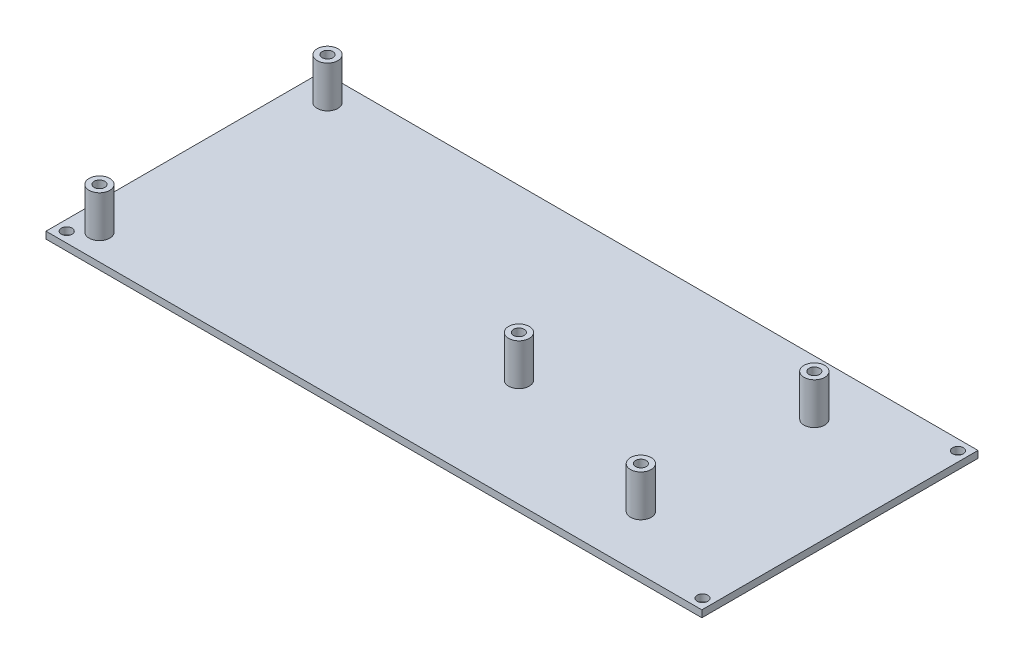
ISO-10303-21;
HEADER;
FILE_DESCRIPTION(('STEP AP214'),'2;1');
FILE_NAME('part.step','',(''),(''),'','','');
FILE_SCHEMA(('AUTOMOTIVE_DESIGN { 1 0 10303 214 1 1 1 1 }'));
ENDSEC;
DATA;
#1=APPLICATION_CONTEXT('core data for automotive mechanical design processes');
#2=APPLICATION_PROTOCOL_DEFINITION('international standard','automotive_design',2000,#1);
#3=PRODUCT_CONTEXT('',#1,'mechanical');
#4=PRODUCT('Part','Part','',(#3));
#5=PRODUCT_RELATED_PRODUCT_CATEGORY('part','',(#4));
#6=PRODUCT_DEFINITION_FORMATION('','',#4);
#7=PRODUCT_DEFINITION_CONTEXT('part definition',#1,'design');
#8=PRODUCT_DEFINITION('design','',#6,#7);
#9=PRODUCT_DEFINITION_SHAPE('','',#8);
#10=(LENGTH_UNIT() NAMED_UNIT(*) SI_UNIT(.MILLI.,.METRE.));
#11=(NAMED_UNIT(*) PLANE_ANGLE_UNIT() SI_UNIT($,.RADIAN.));
#12=(NAMED_UNIT(*) SI_UNIT($,.STERADIAN.) SOLID_ANGLE_UNIT());
#13=UNCERTAINTY_MEASURE_WITH_UNIT(LENGTH_MEASURE(1.E-05),#10,'distance_accuracy_value','');
#14=(GEOMETRIC_REPRESENTATION_CONTEXT(3) GLOBAL_UNCERTAINTY_ASSIGNED_CONTEXT((#13)) GLOBAL_UNIT_ASSIGNED_CONTEXT((#10,
#11,#12)) REPRESENTATION_CONTEXT('',''));
#15=CARTESIAN_POINT('',(0.,0.,0.));
#16=DIRECTION('',(0.,0.,1.));
#17=DIRECTION('',(1.,0.,0.));
#18=AXIS2_PLACEMENT_3D('',#15,#16,#17);
#19=CARTESIAN_POINT('',(0.,2.,0.));
#20=DIRECTION('',(0.,1.,0.));
#21=DIRECTION('',(0.,0.,1.));
#22=AXIS2_PLACEMENT_3D('',#19,#20,#21);
#23=PLANE('',#22);
#24=CARTESIAN_POINT('',(-67.7487922705313,2.,31.9302898550725));
#25=DIRECTION('',(0.,1.,0.));
#26=DIRECTION('',(0.,0.,1.));
#27=AXIS2_PLACEMENT_3D('',#24,#25,#26);
#28=CIRCLE('',#27,3.00000000000001);
#29=CARTESIAN_POINT('',(-67.7487922705313,2.,34.9302898550725));
#30=VERTEX_POINT('',#29);
#31=EDGE_CURVE('E287',#30,#30,#28,.T.);
#32=ORIENTED_EDGE('',*,*,#31,.F.);
#33=EDGE_LOOP('',(#32));
#34=FACE_BOUND('',#33,.T.);
#35=CARTESIAN_POINT('',(-67.2587922705314,2.,-33.6497101449275));
#36=DIRECTION('',(0.,1.,0.));
#37=DIRECTION('',(0.,0.,1.));
#38=AXIS2_PLACEMENT_3D('',#35,#36,#37);
#39=CIRCLE('',#38,3.00000000000001);
#40=CARTESIAN_POINT('',(-67.2587922705314,2.,-30.6497101449275));
#41=VERTEX_POINT('',#40);
#42=EDGE_CURVE('E278',#41,#41,#39,.T.);
#43=ORIENTED_EDGE('',*,*,#42,.F.);
#44=EDGE_LOOP('',(#43));
#45=FACE_BOUND('',#44,.T.);
#46=CARTESIAN_POINT('',(30.1412077294686,2.,8.31028985507247));
#47=DIRECTION('',(0.,1.,0.));
#48=DIRECTION('',(0.,0.,1.));
#49=AXIS2_PLACEMENT_3D('',#46,#47,#48);
#50=CIRCLE('',#49,3.);
#51=CARTESIAN_POINT('',(30.1412077294686,2.,11.3102898550725));
#52=VERTEX_POINT('',#51);
#53=EDGE_CURVE('E269',#52,#52,#50,.T.);
#54=ORIENTED_EDGE('',*,*,#53,.F.);
#55=EDGE_LOOP('',(#54));
#56=FACE_BOUND('',#55,.T.);
#57=CARTESIAN_POINT('',(80.7112077294687,2.,23.5502898550725));
#58=DIRECTION('',(0.,1.,0.));
#59=DIRECTION('',(0.,0.,1.));
#60=AXIS2_PLACEMENT_3D('',#57,#58,#59);
#61=CIRCLE('',#60,3.00000000000001);
#62=CARTESIAN_POINT('',(80.7112077294687,2.,26.5502898550725));
#63=VERTEX_POINT('',#62);
#64=EDGE_CURVE('E261',#63,#63,#61,.T.);
#65=ORIENTED_EDGE('',*,*,#64,.F.);
#66=EDGE_LOOP('',(#65));
#67=FACE_BOUND('',#66,.T.);
#68=CARTESIAN_POINT('',(82.7112077294686,2.,-24.7097101449275));
#69=DIRECTION('',(0.,1.,0.));
#70=DIRECTION('',(0.,0.,1.));
#71=AXIS2_PLACEMENT_3D('',#68,#69,#70);
#72=CIRCLE('',#71,3.00000000000001);
#73=CARTESIAN_POINT('',(82.7112077294686,2.,-21.7097101449275));
#74=VERTEX_POINT('',#73);
#75=EDGE_CURVE('E252',#74,#74,#72,.T.);
#76=ORIENTED_EDGE('',*,*,#75,.F.);
#77=EDGE_LOOP('',(#76));
#78=FACE_BOUND('',#77,.T.);
#79=CARTESIAN_POINT('',(111.435917927843,2.,36.4202898550725));
#80=DIRECTION('',(0.,1.,0.));
#81=DIRECTION('',(0.,0.,1.));
#82=AXIS2_PLACEMENT_3D('',#79,#80,#81);
#83=CIRCLE('',#82,1.54999999999999);
#84=CARTESIAN_POINT('',(111.435917927843,2.,37.9702898550725));
#85=VERTEX_POINT('',#84);
#86=EDGE_CURVE('E238',#85,#85,#83,.T.);
#87=ORIENTED_EDGE('',*,*,#86,.F.);
#88=EDGE_LOOP('',(#87));
#89=FACE_BOUND('',#88,.T.);
#90=CARTESIAN_POINT('',(-72.7487922705314,2.,-37.5797101449275));
#91=DIRECTION('',(0.,1.,0.));
#92=DIRECTION('',(0.,0.,1.));
#93=AXIS2_PLACEMENT_3D('',#90,#91,#92);
#94=CIRCLE('',#93,1.54999999999999);
#95=CARTESIAN_POINT('',(-72.7487922705314,2.,-36.0297101449275));
#96=VERTEX_POINT('',#95);
#97=EDGE_CURVE('E103',#96,#96,#94,.T.);
#98=ORIENTED_EDGE('',*,*,#97,.F.);
#99=EDGE_LOOP('',(#98));
#100=FACE_BOUND('',#99,.T.);
#101=DIRECTION('',(0.,0.,1.));
#102=VECTOR('',#101,1.);
#103=CARTESIAN_POINT('',(-75.7487922705314,2.,-40.5797101449275));
#104=LINE('',#103,#102);
#105=CARTESIAN_POINT('',(-75.7487922705314,2.,-40.5797101449275));
#106=VERTEX_POINT('',#105);
#107=CARTESIAN_POINT('',(-75.7487922705314,2.,39.4202898550725));
#108=VERTEX_POINT('',#107);
#109=EDGE_CURVE('E85',#106,#108,#104,.T.);
#110=ORIENTED_EDGE('',*,*,#109,.T.);
#111=DIRECTION('',(1.,0.,0.));
#112=VECTOR('',#111,1.);
#113=CARTESIAN_POINT('',(-75.7487922705314,2.,39.4202898550725));
#114=LINE('',#113,#112);
#115=CARTESIAN_POINT('',(114.251207729469,2.,39.4202898550725));
#116=VERTEX_POINT('',#115);
#117=EDGE_CURVE('E80',#108,#116,#114,.T.);
#118=ORIENTED_EDGE('',*,*,#117,.T.);
#119=DIRECTION('',(0.,0.,-1.));
#120=VECTOR('',#119,1.);
#121=CARTESIAN_POINT('',(114.251207729469,2.,-40.5797101449275));
#122=LINE('',#121,#120);
#123=CARTESIAN_POINT('',(114.251207729469,2.,-40.5797101449275));
#124=VERTEX_POINT('',#123);
#125=EDGE_CURVE('E83',#116,#124,#122,.T.);
#126=ORIENTED_EDGE('',*,*,#125,.T.);
#127=DIRECTION('',(-1.,0.,0.));
#128=VECTOR('',#127,1.);
#129=CARTESIAN_POINT('',(-75.7487922705314,2.,-40.5797101449275));
#130=LINE('',#129,#128);
#131=EDGE_CURVE('E49',#124,#106,#130,.T.);
#132=ORIENTED_EDGE('',*,*,#131,.T.);
#133=EDGE_LOOP('',(#110,#118,#126,#132));
#134=FACE_BOUND('',#133,.T.);
#135=CARTESIAN_POINT('',(111.435917927843,2.,-37.5797101449275));
#136=DIRECTION('',(0.,1.,0.));
#137=DIRECTION('',(0.,0.,1.));
#138=AXIS2_PLACEMENT_3D('',#135,#136,#137);
#139=CIRCLE('',#138,1.54999999999999);
#140=CARTESIAN_POINT('',(111.435917927843,2.,-36.0297101449275));
#141=VERTEX_POINT('',#140);
#142=EDGE_CURVE('E230',#141,#141,#139,.T.);
#143=ORIENTED_EDGE('',*,*,#142,.F.);
#144=EDGE_LOOP('',(#143));
#145=FACE_BOUND('',#144,.T.);
#146=CARTESIAN_POINT('',(-72.7487922705314,2.,36.4202898550725));
#147=DIRECTION('',(0.,1.,0.));
#148=DIRECTION('',(0.,0.,1.));
#149=AXIS2_PLACEMENT_3D('',#146,#147,#148);
#150=CIRCLE('',#149,1.54999999999999);
#151=CARTESIAN_POINT('',(-72.7487922705314,2.,37.9702898550725));
#152=VERTEX_POINT('',#151);
#153=EDGE_CURVE('E243',#152,#152,#150,.T.);
#154=ORIENTED_EDGE('',*,*,#153,.F.);
#155=EDGE_LOOP('',(#154));
#156=FACE_BOUND('',#155,.T.);
#157=ADVANCED_FACE('F32',(#34,#45,#56,#67,#78,#89,#100,#134,#145,#156),#23,.T.);
#158=CARTESIAN_POINT('',(0.,0.,0.));
#159=DIRECTION('',(0.,1.,0.));
#160=DIRECTION('',(0.,0.,1.));
#161=AXIS2_PLACEMENT_3D('',#158,#159,#160);
#162=PLANE('',#161);
#163=DIRECTION('',(0.,0.,1.));
#164=VECTOR('',#163,1.);
#165=CARTESIAN_POINT('',(-75.7487922705314,0.,-40.5797101449275));
#166=LINE('',#165,#164);
#167=CARTESIAN_POINT('',(-75.7487922705314,0.,-40.5797101449275));
#168=VERTEX_POINT('',#167);
#169=CARTESIAN_POINT('',(-75.7487922705314,0.,39.4202898550725));
#170=VERTEX_POINT('',#169);
#171=EDGE_CURVE('E100',#168,#170,#166,.T.);
#172=ORIENTED_EDGE('',*,*,#171,.F.);
#173=DIRECTION('',(-1.,0.,0.));
#174=VECTOR('',#173,1.);
#175=CARTESIAN_POINT('',(-75.7487922705314,0.,-40.5797101449275));
#176=LINE('',#175,#174);
#177=CARTESIAN_POINT('',(114.251207729469,0.,-40.5797101449275));
#178=VERTEX_POINT('',#177);
#179=EDGE_CURVE('E72',#178,#168,#176,.T.);
#180=ORIENTED_EDGE('',*,*,#179,.F.);
#181=DIRECTION('',(0.,0.,-1.));
#182=VECTOR('',#181,1.);
#183=CARTESIAN_POINT('',(114.251207729469,0.,-40.5797101449275));
#184=LINE('',#183,#182);
#185=CARTESIAN_POINT('',(114.251207729469,0.,39.4202898550725));
#186=VERTEX_POINT('',#185);
#187=EDGE_CURVE('E66',#186,#178,#184,.T.);
#188=ORIENTED_EDGE('',*,*,#187,.F.);
#189=DIRECTION('',(1.,0.,0.));
#190=VECTOR('',#189,1.);
#191=CARTESIAN_POINT('',(-75.7487922705314,0.,39.4202898550725));
#192=LINE('',#191,#190);
#193=EDGE_CURVE('E90',#170,#186,#192,.T.);
#194=ORIENTED_EDGE('',*,*,#193,.F.);
#195=EDGE_LOOP('',(#172,#180,#188,#194));
#196=FACE_BOUND('',#195,.T.);
#197=CARTESIAN_POINT('',(-72.7487922705314,0.,-37.5797101449275));
#198=DIRECTION('',(0.,1.,0.));
#199=DIRECTION('',(0.,0.,1.));
#200=AXIS2_PLACEMENT_3D('',#197,#198,#199);
#201=CIRCLE('',#200,1.54999999999999);
#202=CARTESIAN_POINT('',(-72.7487922705314,0.,-36.0297101449275));
#203=VERTEX_POINT('',#202);
#204=EDGE_CURVE('E228',#203,#203,#201,.T.);
#205=ORIENTED_EDGE('',*,*,#204,.T.);
#206=EDGE_LOOP('',(#205));
#207=FACE_BOUND('',#206,.T.);
#208=CARTESIAN_POINT('',(111.435917927843,0.,-37.5797101449275));
#209=DIRECTION('',(0.,1.,0.));
#210=DIRECTION('',(0.,0.,1.));
#211=AXIS2_PLACEMENT_3D('',#208,#209,#210);
#212=CIRCLE('',#211,1.54999999999999);
#213=CARTESIAN_POINT('',(111.435917927843,0.,-36.0297101449275));
#214=VERTEX_POINT('',#213);
#215=EDGE_CURVE('E234',#214,#214,#212,.T.);
#216=ORIENTED_EDGE('',*,*,#215,.T.);
#217=EDGE_LOOP('',(#216));
#218=FACE_BOUND('',#217,.T.);
#219=CARTESIAN_POINT('',(111.435917927843,0.,36.4202898550725));
#220=DIRECTION('',(0.,1.,0.));
#221=DIRECTION('',(0.,0.,1.));
#222=AXIS2_PLACEMENT_3D('',#219,#220,#221);
#223=CIRCLE('',#222,1.54999999999999);
#224=CARTESIAN_POINT('',(111.435917927843,0.,37.9702898550725));
#225=VERTEX_POINT('',#224);
#226=EDGE_CURVE('E240',#225,#225,#223,.T.);
#227=ORIENTED_EDGE('',*,*,#226,.T.);
#228=EDGE_LOOP('',(#227));
#229=FACE_BOUND('',#228,.T.);
#230=CARTESIAN_POINT('',(-72.7487922705314,0.,36.4202898550725));
#231=DIRECTION('',(0.,1.,0.));
#232=DIRECTION('',(0.,0.,1.));
#233=AXIS2_PLACEMENT_3D('',#230,#231,#232);
#234=CIRCLE('',#233,1.54999999999999);
#235=CARTESIAN_POINT('',(-72.7487922705314,0.,37.9702898550725));
#236=VERTEX_POINT('',#235);
#237=EDGE_CURVE('E246',#236,#236,#234,.T.);
#238=ORIENTED_EDGE('',*,*,#237,.T.);
#239=EDGE_LOOP('',(#238));
#240=FACE_BOUND('',#239,.T.);
#241=ADVANCED_FACE('F150',(#196,#207,#218,#229,#240),#162,.F.);
#242=CARTESIAN_POINT('',(-75.7487922705314,2.,-40.5797101449275));
#243=DIRECTION('',(1.,0.,0.));
#244=DIRECTION('',(0.,0.,-1.));
#245=AXIS2_PLACEMENT_3D('',#242,#243,#244);
#246=PLANE('',#245);
#247=ORIENTED_EDGE('',*,*,#171,.T.);
#248=DIRECTION('',(0.,-1.,0.));
#249=VECTOR('',#248,1.);
#250=CARTESIAN_POINT('',(-75.7487922705314,2.,39.4202898550725));
#251=LINE('',#250,#249);
#252=EDGE_CURVE('E91',#108,#170,#251,.T.);
#253=ORIENTED_EDGE('',*,*,#252,.F.);
#254=ORIENTED_EDGE('',*,*,#109,.F.);
#255=DIRECTION('',(0.,-1.,0.));
#256=VECTOR('',#255,1.);
#257=CARTESIAN_POINT('',(-75.7487922705314,2.,-40.5797101449275));
#258=LINE('',#257,#256);
#259=EDGE_CURVE('E96',#106,#168,#258,.T.);
#260=ORIENTED_EDGE('',*,*,#259,.T.);
#261=EDGE_LOOP('',(#247,#253,#254,#260));
#262=FACE_BOUND('',#261,.T.);
#263=ADVANCED_FACE('F34',(#262),#246,.F.);
#264=CARTESIAN_POINT('',(-75.7487922705314,2.,39.4202898550725));
#265=DIRECTION('',(0.,0.,-1.));
#266=DIRECTION('',(-1.,0.,0.));
#267=AXIS2_PLACEMENT_3D('',#264,#265,#266);
#268=PLANE('',#267);
#269=ORIENTED_EDGE('',*,*,#193,.T.);
#270=DIRECTION('',(0.,-1.,0.));
#271=VECTOR('',#270,1.);
#272=CARTESIAN_POINT('',(114.251207729469,2.,39.4202898550725));
#273=LINE('',#272,#271);
#274=EDGE_CURVE('E88',#116,#186,#273,.T.);
#275=ORIENTED_EDGE('',*,*,#274,.F.);
#276=ORIENTED_EDGE('',*,*,#117,.F.);
#277=ORIENTED_EDGE('',*,*,#252,.T.);
#278=EDGE_LOOP('',(#269,#275,#276,#277));
#279=FACE_BOUND('',#278,.T.);
#280=ADVANCED_FACE('F89',(#279),#268,.F.);
#281=CARTESIAN_POINT('',(114.251207729469,2.,-40.5797101449275));
#282=DIRECTION('',(-1.,0.,0.));
#283=DIRECTION('',(0.,0.,1.));
#284=AXIS2_PLACEMENT_3D('',#281,#282,#283);
#285=PLANE('',#284);
#286=ORIENTED_EDGE('',*,*,#187,.T.);
#287=DIRECTION('',(0.,-1.,0.));
#288=VECTOR('',#287,1.);
#289=CARTESIAN_POINT('',(114.251207729469,2.,-40.5797101449275));
#290=LINE('',#289,#288);
#291=EDGE_CURVE('E92',#124,#178,#290,.T.);
#292=ORIENTED_EDGE('',*,*,#291,.F.);
#293=ORIENTED_EDGE('',*,*,#125,.F.);
#294=ORIENTED_EDGE('',*,*,#274,.T.);
#295=EDGE_LOOP('',(#286,#292,#293,#294));
#296=FACE_BOUND('',#295,.T.);
#297=ADVANCED_FACE('F94',(#296),#285,.F.);
#298=CARTESIAN_POINT('',(-75.7487922705314,2.,-40.5797101449275));
#299=DIRECTION('',(0.,0.,1.));
#300=DIRECTION('',(1.,0.,0.));
#301=AXIS2_PLACEMENT_3D('',#298,#299,#300);
#302=PLANE('',#301);
#303=ORIENTED_EDGE('',*,*,#179,.T.);
#304=ORIENTED_EDGE('',*,*,#259,.F.);
#305=ORIENTED_EDGE('',*,*,#131,.F.);
#306=ORIENTED_EDGE('',*,*,#291,.T.);
#307=EDGE_LOOP('',(#303,#304,#305,#306));
#308=FACE_BOUND('',#307,.T.);
#309=ADVANCED_FACE('F217',(#308),#302,.F.);
#310=CARTESIAN_POINT('',(-72.7487922705314,2.,-37.5797101449275));
#311=DIRECTION('',(0.,-1.,0.));
#312=DIRECTION('',(0.,0.,-1.));
#313=AXIS2_PLACEMENT_3D('',#310,#311,#312);
#314=CYLINDRICAL_SURFACE('',#313,1.54999999999999);
#315=ORIENTED_EDGE('',*,*,#97,.T.);
#316=EDGE_LOOP('',(#315));
#317=FACE_BOUND('',#316,.T.);
#318=ORIENTED_EDGE('',*,*,#204,.F.);
#319=EDGE_LOOP('',(#318));
#320=FACE_BOUND('',#319,.T.);
#321=ADVANCED_FACE('F214',(#317,#320),#314,.F.);
#322=CARTESIAN_POINT('',(111.435917927843,2.,-37.5797101449275));
#323=DIRECTION('',(0.,-1.,0.));
#324=DIRECTION('',(0.,0.,-1.));
#325=AXIS2_PLACEMENT_3D('',#322,#323,#324);
#326=CYLINDRICAL_SURFACE('',#325,1.54999999999999);
#327=ORIENTED_EDGE('',*,*,#142,.T.);
#328=EDGE_LOOP('',(#327));
#329=FACE_BOUND('',#328,.T.);
#330=ORIENTED_EDGE('',*,*,#215,.F.);
#331=EDGE_LOOP('',(#330));
#332=FACE_BOUND('',#331,.T.);
#333=ADVANCED_FACE('F211',(#329,#332),#326,.F.);
#334=CARTESIAN_POINT('',(111.435917927843,2.,36.4202898550725));
#335=DIRECTION('',(0.,-1.,0.));
#336=DIRECTION('',(0.,0.,-1.));
#337=AXIS2_PLACEMENT_3D('',#334,#335,#336);
#338=CYLINDRICAL_SURFACE('',#337,1.54999999999999);
#339=ORIENTED_EDGE('',*,*,#86,.T.);
#340=EDGE_LOOP('',(#339));
#341=FACE_BOUND('',#340,.T.);
#342=ORIENTED_EDGE('',*,*,#226,.F.);
#343=EDGE_LOOP('',(#342));
#344=FACE_BOUND('',#343,.T.);
#345=ADVANCED_FACE('F207',(#341,#344),#338,.F.);
#346=CARTESIAN_POINT('',(-72.7487922705314,2.,36.4202898550725));
#347=DIRECTION('',(0.,-1.,0.));
#348=DIRECTION('',(0.,0.,-1.));
#349=AXIS2_PLACEMENT_3D('',#346,#347,#348);
#350=CYLINDRICAL_SURFACE('',#349,1.54999999999999);
#351=ORIENTED_EDGE('',*,*,#153,.T.);
#352=EDGE_LOOP('',(#351));
#353=FACE_BOUND('',#352,.T.);
#354=ORIENTED_EDGE('',*,*,#237,.F.);
#355=EDGE_LOOP('',(#354));
#356=FACE_BOUND('',#355,.T.);
#357=ADVANCED_FACE('F200',(#353,#356),#350,.F.);
#358=CARTESIAN_POINT('',(82.7112077294686,14.,-24.7097101449275));
#359=DIRECTION('',(0.,1.,0.));
#360=DIRECTION('',(0.,0.,1.));
#361=AXIS2_PLACEMENT_3D('',#358,#359,#360);
#362=PLANE('',#361);
#363=CARTESIAN_POINT('',(82.7112077294686,14.,-24.7097101449275));
#364=DIRECTION('',(0.,1.,0.));
#365=DIRECTION('',(0.,0.,1.));
#366=AXIS2_PLACEMENT_3D('',#363,#364,#365);
#367=CIRCLE('',#366,3.00000000000001);
#368=CARTESIAN_POINT('',(82.7112077294686,14.,-21.7097101449275));
#369=VERTEX_POINT('',#368);
#370=EDGE_CURVE('E249',#369,#369,#367,.T.);
#371=ORIENTED_EDGE('',*,*,#370,.T.);
#372=EDGE_LOOP('',(#371));
#373=FACE_BOUND('',#372,.T.);
#374=CARTESIAN_POINT('',(82.7112077294686,14.,-24.7097101449275));
#375=DIRECTION('',(0.,1.,0.));
#376=DIRECTION('',(0.,0.,1.));
#377=AXIS2_PLACEMENT_3D('',#374,#375,#376);
#378=CIRCLE('',#377,1.54999999999999);
#379=CARTESIAN_POINT('',(82.7112077294686,14.,-23.1597101449275));
#380=VERTEX_POINT('',#379);
#381=EDGE_CURVE('E255',#380,#380,#378,.T.);
#382=ORIENTED_EDGE('',*,*,#381,.F.);
#383=EDGE_LOOP('',(#382));
#384=FACE_BOUND('',#383,.T.);
#385=ADVANCED_FACE('F197',(#373,#384),#362,.T.);
#386=CARTESIAN_POINT('',(82.7112077294686,14.,-24.7097101449275));
#387=DIRECTION('',(0.,-1.,0.));
#388=DIRECTION('',(0.,0.,-1.));
#389=AXIS2_PLACEMENT_3D('',#386,#387,#388);
#390=CYLINDRICAL_SURFACE('',#389,3.00000000000001);
#391=ORIENTED_EDGE('',*,*,#370,.F.);
#392=EDGE_LOOP('',(#391));
#393=FACE_BOUND('',#392,.T.);
#394=ORIENTED_EDGE('',*,*,#75,.T.);
#395=EDGE_LOOP('',(#394));
#396=FACE_BOUND('',#395,.T.);
#397=ADVANCED_FACE('F170',(#393,#396),#390,.T.);
#398=CARTESIAN_POINT('',(82.7112077294686,14.,-24.7097101449275));
#399=DIRECTION('',(0.,-1.,0.));
#400=DIRECTION('',(0.,0.,-1.));
#401=AXIS2_PLACEMENT_3D('',#398,#399,#400);
#402=CYLINDRICAL_SURFACE('',#401,1.54999999999999);
#403=ORIENTED_EDGE('',*,*,#381,.T.);
#404=EDGE_LOOP('',(#403));
#405=FACE_BOUND('',#404,.T.);
#406=CARTESIAN_POINT('',(82.7112077294686,2.,-24.7097101449275));
#407=DIRECTION('',(0.,1.,0.));
#408=DIRECTION('',(0.,0.,1.));
#409=AXIS2_PLACEMENT_3D('',#406,#407,#408);
#410=CIRCLE('',#409,1.54999999999999);
#411=CARTESIAN_POINT('',(82.7112077294686,2.,-23.1597101449275));
#412=VERTEX_POINT('',#411);
#413=EDGE_CURVE('E110',#412,#412,#410,.F.);
#414=ORIENTED_EDGE('',*,*,#413,.T.);
#415=EDGE_LOOP('',(#414));
#416=FACE_BOUND('',#415,.T.);
#417=ADVANCED_FACE('F161',(#405,#416),#402,.F.);
#418=ORIENTED_EDGE('',*,*,#413,.F.);
#419=EDGE_LOOP('',(#418));
#420=FACE_BOUND('',#419,.T.);
#421=ADVANCED_FACE('F152',(#420),#23,.T.);
#422=CARTESIAN_POINT('',(80.7112077294687,14.,23.5502898550725));
#423=DIRECTION('',(0.,1.,0.));
#424=DIRECTION('',(0.,0.,1.));
#425=AXIS2_PLACEMENT_3D('',#422,#423,#424);
#426=PLANE('',#425);
#427=CARTESIAN_POINT('',(80.7112077294687,14.,23.5502898550725));
#428=DIRECTION('',(0.,1.,0.));
#429=DIRECTION('',(0.,0.,1.));
#430=AXIS2_PLACEMENT_3D('',#427,#428,#429);
#431=CIRCLE('',#430,3.00000000000001);
#432=CARTESIAN_POINT('',(80.7112077294687,14.,26.5502898550725));
#433=VERTEX_POINT('',#432);
#434=EDGE_CURVE('E260',#433,#433,#431,.T.);
#435=ORIENTED_EDGE('',*,*,#434,.T.);
#436=EDGE_LOOP('',(#435));
#437=FACE_BOUND('',#436,.T.);
#438=CARTESIAN_POINT('',(80.7112077294687,14.,23.5502898550725));
#439=DIRECTION('',(0.,1.,0.));
#440=DIRECTION('',(0.,0.,1.));
#441=AXIS2_PLACEMENT_3D('',#438,#439,#440);
#442=CIRCLE('',#441,1.54999999999999);
#443=CARTESIAN_POINT('',(80.7112077294687,14.,25.1002898550725));
#444=VERTEX_POINT('',#443);
#445=EDGE_CURVE('E264',#444,#444,#442,.T.);
#446=ORIENTED_EDGE('',*,*,#445,.F.);
#447=EDGE_LOOP('',(#446));
#448=FACE_BOUND('',#447,.T.);
#449=ADVANCED_FACE('F160',(#437,#448),#426,.T.);
#450=CARTESIAN_POINT('',(80.7112077294687,14.,23.5502898550725));
#451=DIRECTION('',(0.,-1.,0.));
#452=DIRECTION('',(0.,0.,-1.));
#453=AXIS2_PLACEMENT_3D('',#450,#451,#452);
#454=CYLINDRICAL_SURFACE('',#453,3.00000000000001);
#455=ORIENTED_EDGE('',*,*,#434,.F.);
#456=EDGE_LOOP('',(#455));
#457=FACE_BOUND('',#456,.T.);
#458=ORIENTED_EDGE('',*,*,#64,.T.);
#459=EDGE_LOOP('',(#458));
#460=FACE_BOUND('',#459,.T.);
#461=ADVANCED_FACE('F167',(#457,#460),#454,.T.);
#462=CARTESIAN_POINT('',(80.7112077294687,14.,23.5502898550725));
#463=DIRECTION('',(0.,-1.,0.));
#464=DIRECTION('',(0.,0.,-1.));
#465=AXIS2_PLACEMENT_3D('',#462,#463,#464);
#466=CYLINDRICAL_SURFACE('',#465,1.54999999999999);
#467=ORIENTED_EDGE('',*,*,#445,.T.);
#468=EDGE_LOOP('',(#467));
#469=FACE_BOUND('',#468,.T.);
#470=CARTESIAN_POINT('',(80.7112077294687,2.,23.5502898550725));
#471=DIRECTION('',(0.,1.,0.));
#472=DIRECTION('',(0.,0.,1.));
#473=AXIS2_PLACEMENT_3D('',#470,#471,#472);
#474=CIRCLE('',#473,1.54999999999999);
#475=CARTESIAN_POINT('',(80.7112077294687,2.,25.1002898550725));
#476=VERTEX_POINT('',#475);
#477=EDGE_CURVE('E113',#476,#476,#474,.F.);
#478=ORIENTED_EDGE('',*,*,#477,.T.);
#479=EDGE_LOOP('',(#478));
#480=FACE_BOUND('',#479,.T.);
#481=ADVANCED_FACE('F176',(#469,#480),#466,.F.);
#482=ORIENTED_EDGE('',*,*,#477,.F.);
#483=EDGE_LOOP('',(#482));
#484=FACE_BOUND('',#483,.T.);
#485=ADVANCED_FACE('F145',(#484),#23,.T.);
#486=CARTESIAN_POINT('',(30.1412077294686,14.,8.31028985507247));
#487=DIRECTION('',(0.,1.,0.));
#488=DIRECTION('',(0.,0.,1.));
#489=AXIS2_PLACEMENT_3D('',#486,#487,#488);
#490=PLANE('',#489);
#491=CARTESIAN_POINT('',(30.1412077294686,14.,8.31028985507247));
#492=DIRECTION('',(0.,1.,0.));
#493=DIRECTION('',(0.,0.,1.));
#494=AXIS2_PLACEMENT_3D('',#491,#492,#493);
#495=CIRCLE('',#494,3.);
#496=CARTESIAN_POINT('',(30.1412077294686,14.,11.3102898550725));
#497=VERTEX_POINT('',#496);
#498=EDGE_CURVE('E268',#497,#497,#495,.T.);
#499=ORIENTED_EDGE('',*,*,#498,.T.);
#500=EDGE_LOOP('',(#499));
#501=FACE_BOUND('',#500,.T.);
#502=CARTESIAN_POINT('',(30.1412077294686,14.,8.31028985507247));
#503=DIRECTION('',(0.,1.,0.));
#504=DIRECTION('',(0.,0.,1.));
#505=AXIS2_PLACEMENT_3D('',#502,#503,#504);
#506=CIRCLE('',#505,1.55);
#507=CARTESIAN_POINT('',(30.1412077294686,14.,9.86028985507247));
#508=VERTEX_POINT('',#507);
#509=EDGE_CURVE('E272',#508,#508,#506,.T.);
#510=ORIENTED_EDGE('',*,*,#509,.F.);
#511=EDGE_LOOP('',(#510));
#512=FACE_BOUND('',#511,.T.);
#513=ADVANCED_FACE('F175',(#501,#512),#490,.T.);
#514=CARTESIAN_POINT('',(30.1412077294686,14.,8.31028985507247));
#515=DIRECTION('',(0.,-1.,0.));
#516=DIRECTION('',(0.,0.,-1.));
#517=AXIS2_PLACEMENT_3D('',#514,#515,#516);
#518=CYLINDRICAL_SURFACE('',#517,3.);
#519=ORIENTED_EDGE('',*,*,#498,.F.);
#520=EDGE_LOOP('',(#519));
#521=FACE_BOUND('',#520,.T.);
#522=ORIENTED_EDGE('',*,*,#53,.T.);
#523=EDGE_LOOP('',(#522));
#524=FACE_BOUND('',#523,.T.);
#525=ADVANCED_FACE('F182',(#521,#524),#518,.T.);
#526=CARTESIAN_POINT('',(30.1412077294686,14.,8.31028985507247));
#527=DIRECTION('',(0.,-1.,0.));
#528=DIRECTION('',(0.,0.,-1.));
#529=AXIS2_PLACEMENT_3D('',#526,#527,#528);
#530=CYLINDRICAL_SURFACE('',#529,1.55);
#531=ORIENTED_EDGE('',*,*,#509,.T.);
#532=EDGE_LOOP('',(#531));
#533=FACE_BOUND('',#532,.T.);
#534=CARTESIAN_POINT('',(30.1412077294686,2.,8.31028985507247));
#535=DIRECTION('',(0.,1.,0.));
#536=DIRECTION('',(0.,0.,1.));
#537=AXIS2_PLACEMENT_3D('',#534,#535,#536);
#538=CIRCLE('',#537,1.55);
#539=CARTESIAN_POINT('',(30.1412077294686,2.,9.86028985507247));
#540=VERTEX_POINT('',#539);
#541=EDGE_CURVE('E116',#540,#540,#538,.F.);
#542=ORIENTED_EDGE('',*,*,#541,.T.);
#543=EDGE_LOOP('',(#542));
#544=FACE_BOUND('',#543,.T.);
#545=ADVANCED_FACE('F143',(#533,#544),#530,.F.);
#546=ORIENTED_EDGE('',*,*,#541,.F.);
#547=EDGE_LOOP('',(#546));
#548=FACE_BOUND('',#547,.T.);
#549=ADVANCED_FACE('F127',(#548),#23,.T.);
#550=CARTESIAN_POINT('',(-67.2587922705314,14.,-33.6497101449275));
#551=DIRECTION('',(0.,1.,0.));
#552=DIRECTION('',(0.,0.,1.));
#553=AXIS2_PLACEMENT_3D('',#550,#551,#552);
#554=PLANE('',#553);
#555=CARTESIAN_POINT('',(-67.2587922705314,14.,-33.6497101449275));
#556=DIRECTION('',(0.,1.,0.));
#557=DIRECTION('',(0.,0.,1.));
#558=AXIS2_PLACEMENT_3D('',#555,#556,#557);
#559=CIRCLE('',#558,3.00000000000001);
#560=CARTESIAN_POINT('',(-67.2587922705314,14.,-30.6497101449275));
#561=VERTEX_POINT('',#560);
#562=EDGE_CURVE('E277',#561,#561,#559,.T.);
#563=ORIENTED_EDGE('',*,*,#562,.T.);
#564=EDGE_LOOP('',(#563));
#565=FACE_BOUND('',#564,.T.);
#566=CARTESIAN_POINT('',(-67.2587922705314,14.,-33.6497101449275));
#567=DIRECTION('',(0.,1.,0.));
#568=DIRECTION('',(0.,0.,1.));
#569=AXIS2_PLACEMENT_3D('',#566,#567,#568);
#570=CIRCLE('',#569,1.54999999999999);
#571=CARTESIAN_POINT('',(-67.2587922705314,14.,-32.0997101449275));
#572=VERTEX_POINT('',#571);
#573=EDGE_CURVE('E281',#572,#572,#570,.T.);
#574=ORIENTED_EDGE('',*,*,#573,.F.);
#575=EDGE_LOOP('',(#574));
#576=FACE_BOUND('',#575,.T.);
#577=ADVANCED_FACE('F142',(#565,#576),#554,.T.);
#578=CARTESIAN_POINT('',(-67.2587922705314,14.,-33.6497101449275));
#579=DIRECTION('',(0.,-1.,0.));
#580=DIRECTION('',(0.,0.,-1.));
#581=AXIS2_PLACEMENT_3D('',#578,#579,#580);
#582=CYLINDRICAL_SURFACE('',#581,3.00000000000001);
#583=ORIENTED_EDGE('',*,*,#562,.F.);
#584=EDGE_LOOP('',(#583));
#585=FACE_BOUND('',#584,.T.);
#586=ORIENTED_EDGE('',*,*,#42,.T.);
#587=EDGE_LOOP('',(#586));
#588=FACE_BOUND('',#587,.T.);
#589=ADVANCED_FACE('F136',(#585,#588),#582,.T.);
#590=CARTESIAN_POINT('',(-67.2587922705314,14.,-33.6497101449275));
#591=DIRECTION('',(0.,-1.,0.));
#592=DIRECTION('',(0.,0.,-1.));
#593=AXIS2_PLACEMENT_3D('',#590,#591,#592);
#594=CYLINDRICAL_SURFACE('',#593,1.54999999999999);
#595=ORIENTED_EDGE('',*,*,#573,.T.);
#596=EDGE_LOOP('',(#595));
#597=FACE_BOUND('',#596,.T.);
#598=CARTESIAN_POINT('',(-67.2587922705314,2.,-33.6497101449275));
#599=DIRECTION('',(0.,1.,0.));
#600=DIRECTION('',(0.,0.,1.));
#601=AXIS2_PLACEMENT_3D('',#598,#599,#600);
#602=CIRCLE('',#601,1.54999999999999);
#603=CARTESIAN_POINT('',(-67.2587922705314,2.,-32.0997101449275));
#604=VERTEX_POINT('',#603);
#605=EDGE_CURVE('E41',#604,#604,#602,.F.);
#606=ORIENTED_EDGE('',*,*,#605,.T.);
#607=EDGE_LOOP('',(#606));
#608=FACE_BOUND('',#607,.T.);
#609=ADVANCED_FACE('F121',(#597,#608),#594,.F.);
#610=ORIENTED_EDGE('',*,*,#605,.F.);
#611=EDGE_LOOP('',(#610));
#612=FACE_BOUND('',#611,.T.);
#613=ADVANCED_FACE('F123',(#612),#23,.T.);
#614=CARTESIAN_POINT('',(-67.7487922705313,14.,31.9302898550725));
#615=DIRECTION('',(0.,1.,0.));
#616=DIRECTION('',(0.,0.,1.));
#617=AXIS2_PLACEMENT_3D('',#614,#615,#616);
#618=PLANE('',#617);
#619=CARTESIAN_POINT('',(-67.7487922705313,14.,31.9302898550725));
#620=DIRECTION('',(0.,1.,0.));
#621=DIRECTION('',(0.,0.,1.));
#622=AXIS2_PLACEMENT_3D('',#619,#620,#621);
#623=CIRCLE('',#622,3.00000000000001);
#624=CARTESIAN_POINT('',(-67.7487922705313,14.,34.9302898550725));
#625=VERTEX_POINT('',#624);
#626=EDGE_CURVE('E286',#625,#625,#623,.T.);
#627=ORIENTED_EDGE('',*,*,#626,.T.);
#628=EDGE_LOOP('',(#627));
#629=FACE_BOUND('',#628,.T.);
#630=CARTESIAN_POINT('',(-67.7487922705313,14.,31.9302898550725));
#631=DIRECTION('',(0.,1.,0.));
#632=DIRECTION('',(0.,0.,1.));
#633=AXIS2_PLACEMENT_3D('',#630,#631,#632);
#634=CIRCLE('',#633,1.54999999999999);
#635=CARTESIAN_POINT('',(-67.7487922705313,14.,33.4802898550725));
#636=VERTEX_POINT('',#635);
#637=EDGE_CURVE('E290',#636,#636,#634,.T.);
#638=ORIENTED_EDGE('',*,*,#637,.F.);
#639=EDGE_LOOP('',(#638));
#640=FACE_BOUND('',#639,.T.);
#641=ADVANCED_FACE('F125',(#629,#640),#618,.T.);
#642=CARTESIAN_POINT('',(-67.7487922705313,14.,31.9302898550725));
#643=DIRECTION('',(0.,-1.,0.));
#644=DIRECTION('',(0.,0.,-1.));
#645=AXIS2_PLACEMENT_3D('',#642,#643,#644);
#646=CYLINDRICAL_SURFACE('',#645,3.00000000000001);
#647=ORIENTED_EDGE('',*,*,#626,.F.);
#648=EDGE_LOOP('',(#647));
#649=FACE_BOUND('',#648,.T.);
#650=ORIENTED_EDGE('',*,*,#31,.T.);
#651=EDGE_LOOP('',(#650));
#652=FACE_BOUND('',#651,.T.);
#653=ADVANCED_FACE('F133',(#649,#652),#646,.T.);
#654=CARTESIAN_POINT('',(-67.7487922705313,14.,31.9302898550725));
#655=DIRECTION('',(0.,-1.,0.));
#656=DIRECTION('',(0.,0.,-1.));
#657=AXIS2_PLACEMENT_3D('',#654,#655,#656);
#658=CYLINDRICAL_SURFACE('',#657,1.54999999999999);
#659=ORIENTED_EDGE('',*,*,#637,.T.);
#660=EDGE_LOOP('',(#659));
#661=FACE_BOUND('',#660,.T.);
#662=CARTESIAN_POINT('',(-67.7487922705313,2.,31.9302898550725));
#663=DIRECTION('',(0.,1.,0.));
#664=DIRECTION('',(0.,0.,1.));
#665=AXIS2_PLACEMENT_3D('',#662,#663,#664);
#666=CIRCLE('',#665,1.54999999999999);
#667=CARTESIAN_POINT('',(-67.7487922705313,2.,33.4802898550725));
#668=VERTEX_POINT('',#667);
#669=EDGE_CURVE('E11',#668,#668,#666,.F.);
#670=ORIENTED_EDGE('',*,*,#669,.T.);
#671=EDGE_LOOP('',(#670));
#672=FACE_BOUND('',#671,.T.);
#673=ADVANCED_FACE('F147',(#661,#672),#658,.F.);
#674=ORIENTED_EDGE('',*,*,#669,.F.);
#675=EDGE_LOOP('',(#674));
#676=FACE_BOUND('',#675,.T.);
#677=ADVANCED_FACE('F128',(#676),#23,.T.);
#678=CLOSED_SHELL('',(#157,#241,#263,#280,#297,#309,#321,#333,#345,#357,#385,#397,#417,#421,
#449,#461,#481,#485,#513,#525,#545,#549,#577,#589,#609,#613,#641,#653,#673,#677));
#679=MANIFOLD_SOLID_BREP('B2',#678);
#680=ADVANCED_BREP_SHAPE_REPRESENTATION('',(#18,#679),#14);
#681=SHAPE_DEFINITION_REPRESENTATION(#9,#680);
ENDSEC;
END-ISO-10303-21;
